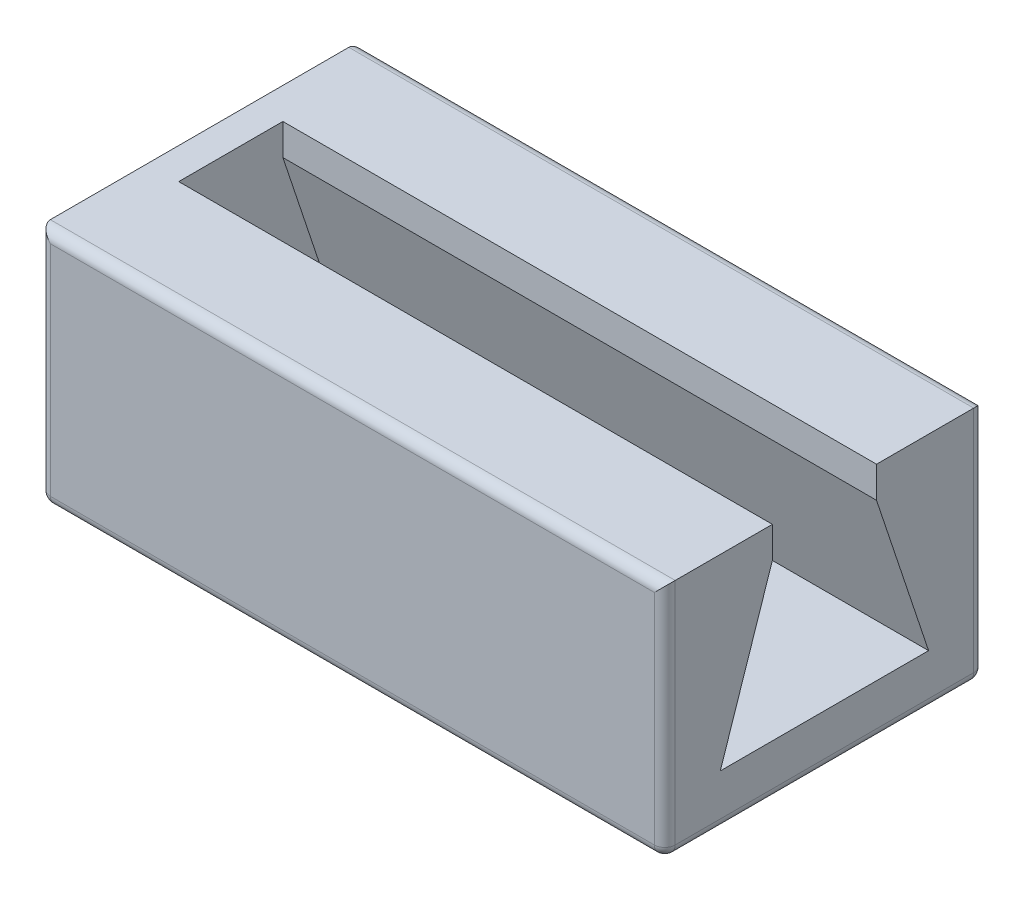
ISO-10303-21;
HEADER;
FILE_DESCRIPTION(('STEP AP214'),'2;1');
FILE_NAME('part.step','',(''),(''),'','','');
FILE_SCHEMA(('AUTOMOTIVE_DESIGN { 1 0 10303 214 1 1 1 1 }'));
ENDSEC;
DATA;
#1=APPLICATION_CONTEXT('core data for automotive mechanical design processes');
#2=APPLICATION_PROTOCOL_DEFINITION('international standard','automotive_design',2000,#1);
#3=PRODUCT_CONTEXT('',#1,'mechanical');
#4=PRODUCT('Part','Part','',(#3));
#5=PRODUCT_RELATED_PRODUCT_CATEGORY('part','',(#4));
#6=PRODUCT_DEFINITION_FORMATION('','',#4);
#7=PRODUCT_DEFINITION_CONTEXT('part definition',#1,'design');
#8=PRODUCT_DEFINITION('design','',#6,#7);
#9=PRODUCT_DEFINITION_SHAPE('','',#8);
#10=(LENGTH_UNIT() NAMED_UNIT(*) SI_UNIT(.MILLI.,.METRE.));
#11=(NAMED_UNIT(*) PLANE_ANGLE_UNIT() SI_UNIT($,.RADIAN.));
#12=(NAMED_UNIT(*) SI_UNIT($,.STERADIAN.) SOLID_ANGLE_UNIT());
#13=UNCERTAINTY_MEASURE_WITH_UNIT(LENGTH_MEASURE(1.E-05),#10,'distance_accuracy_value','');
#14=(GEOMETRIC_REPRESENTATION_CONTEXT(3) GLOBAL_UNCERTAINTY_ASSIGNED_CONTEXT((#13)) GLOBAL_UNIT_ASSIGNED_CONTEXT((#10,
#11,#12)) REPRESENTATION_CONTEXT('',''));
#15=CARTESIAN_POINT('',(0.,0.,0.));
#16=DIRECTION('',(0.,0.,1.));
#17=DIRECTION('',(1.,0.,0.));
#18=AXIS2_PLACEMENT_3D('',#15,#16,#17);
#19=CARTESIAN_POINT('',(60.,0.,-30.66));
#20=DIRECTION('',(0.,1.,0.));
#21=DIRECTION('',(0.,0.,1.));
#22=AXIS2_PLACEMENT_3D('',#19,#20,#21);
#23=PLANE('',#22);
#24=DIRECTION('',(-1.,0.,0.));
#25=VECTOR('',#24,1.);
#26=CARTESIAN_POINT('',(60.,0.,-1.));
#27=LINE('',#26,#25);
#28=CARTESIAN_POINT('',(59.,0.,-1.));
#29=VERTEX_POINT('',#28);
#30=CARTESIAN_POINT('',(1.,0.,-1.));
#31=VERTEX_POINT('',#30);
#32=EDGE_CURVE('E208',#29,#31,#27,.T.);
#33=ORIENTED_EDGE('',*,*,#32,.T.);
#34=DIRECTION('',(0.,0.,-1.));
#35=VECTOR('',#34,1.);
#36=CARTESIAN_POINT('',(1.,0.,-30.66));
#37=LINE('',#36,#35);
#38=CARTESIAN_POINT('',(1.,0.,-29.66));
#39=VERTEX_POINT('',#38);
#40=EDGE_CURVE('E213',#31,#39,#37,.T.);
#41=ORIENTED_EDGE('',*,*,#40,.T.);
#42=DIRECTION('',(-1.,0.,0.));
#43=VECTOR('',#42,1.);
#44=CARTESIAN_POINT('',(60.,0.,-29.66));
#45=LINE('',#44,#43);
#46=CARTESIAN_POINT('',(59.,0.,-29.66));
#47=VERTEX_POINT('',#46);
#48=EDGE_CURVE('E210',#39,#47,#45,.F.);
#49=ORIENTED_EDGE('',*,*,#48,.T.);
#50=DIRECTION('',(0.,0.,-1.));
#51=VECTOR('',#50,1.);
#52=CARTESIAN_POINT('',(59.,0.,-30.66));
#53=LINE('',#52,#51);
#54=EDGE_CURVE('E206',#47,#29,#53,.F.);
#55=ORIENTED_EDGE('',*,*,#54,.T.);
#56=EDGE_LOOP('',(#33,#41,#49,#55));
#57=FACE_BOUND('',#56,.T.);
#58=ADVANCED_FACE('F37',(#57),#23,.F.);
#59=CARTESIAN_POINT('',(60.,23.,-30.66));
#60=DIRECTION('',(0.,0.,1.));
#61=DIRECTION('',(0.,-1.,0.));
#62=AXIS2_PLACEMENT_3D('',#59,#60,#61);
#63=PLANE('',#62);
#64=DIRECTION('',(0.,1.,0.));
#65=VECTOR('',#64,1.);
#66=CARTESIAN_POINT('',(59.,23.,-30.66));
#67=LINE('',#66,#65);
#68=CARTESIAN_POINT('',(59.,22.,-30.66));
#69=VERTEX_POINT('',#68);
#70=CARTESIAN_POINT('',(59.,0.999999999999998,-30.66));
#71=VERTEX_POINT('',#70);
#72=EDGE_CURVE('E201',#69,#71,#67,.F.);
#73=ORIENTED_EDGE('',*,*,#72,.T.);
#74=DIRECTION('',(-1.,0.,0.));
#75=VECTOR('',#74,1.);
#76=CARTESIAN_POINT('',(60.,0.999999999999997,-30.66));
#77=LINE('',#76,#75);
#78=CARTESIAN_POINT('',(1.,0.999999999999998,-30.66));
#79=VERTEX_POINT('',#78);
#80=EDGE_CURVE('E203',#71,#79,#77,.T.);
#81=ORIENTED_EDGE('',*,*,#80,.T.);
#82=DIRECTION('',(0.,1.,0.));
#83=VECTOR('',#82,1.);
#84=CARTESIAN_POINT('',(1.,23.,-30.66));
#85=LINE('',#84,#83);
#86=CARTESIAN_POINT('',(1.,22.,-30.66));
#87=VERTEX_POINT('',#86);
#88=EDGE_CURVE('E166',#79,#87,#85,.T.);
#89=ORIENTED_EDGE('',*,*,#88,.T.);
#90=DIRECTION('',(-1.,0.,0.));
#91=VECTOR('',#90,1.);
#92=CARTESIAN_POINT('',(60.,22.,-30.66));
#93=LINE('',#92,#91);
#94=EDGE_CURVE('E199',#87,#69,#93,.F.);
#95=ORIENTED_EDGE('',*,*,#94,.T.);
#96=EDGE_LOOP('',(#73,#81,#89,#95));
#97=FACE_BOUND('',#96,.T.);
#98=ADVANCED_FACE('F353',(#97),#63,.F.);
#99=CARTESIAN_POINT('',(60.,20.,-20.33));
#100=DIRECTION('',(0.,0.,-1.));
#101=DIRECTION('',(0.,1.,0.));
#102=AXIS2_PLACEMENT_3D('',#99,#100,#101);
#103=PLANE('',#102);
#104=DIRECTION('',(-1.,0.,0.));
#105=VECTOR('',#104,1.);
#106=CARTESIAN_POINT('',(60.,23.,-20.33));
#107=LINE('',#106,#105);
#108=CARTESIAN_POINT('',(60.,23.,-20.33));
#109=VERTEX_POINT('',#108);
#110=CARTESIAN_POINT('',(3.,23.,-20.33));
#111=VERTEX_POINT('',#110);
#112=EDGE_CURVE('E54',#109,#111,#107,.T.);
#113=ORIENTED_EDGE('',*,*,#112,.T.);
#114=DIRECTION('',(0.,-1.,0.));
#115=VECTOR('',#114,1.);
#116=CARTESIAN_POINT('',(3.,20.,-20.33));
#117=LINE('',#116,#115);
#118=CARTESIAN_POINT('',(3.,20.,-20.33));
#119=VERTEX_POINT('',#118);
#120=EDGE_CURVE('E58',#111,#119,#117,.T.);
#121=ORIENTED_EDGE('',*,*,#120,.T.);
#122=DIRECTION('',(-1.,0.,0.));
#123=VECTOR('',#122,1.);
#124=CARTESIAN_POINT('',(60.,20.,-20.33));
#125=LINE('',#124,#123);
#126=CARTESIAN_POINT('',(60.,20.,-20.33));
#127=VERTEX_POINT('',#126);
#128=EDGE_CURVE('E167',#127,#119,#125,.T.);
#129=ORIENTED_EDGE('',*,*,#128,.F.);
#130=DIRECTION('',(0.,-1.,0.));
#131=VECTOR('',#130,1.);
#132=CARTESIAN_POINT('',(60.,20.,-20.33));
#133=LINE('',#132,#131);
#134=EDGE_CURVE('E153',#109,#127,#133,.T.);
#135=ORIENTED_EDGE('',*,*,#134,.F.);
#136=EDGE_LOOP('',(#113,#121,#129,#135));
#137=FACE_BOUND('',#136,.T.);
#138=ADVANCED_FACE('F169',(#137),#103,.F.);
#139=CARTESIAN_POINT('',(60.,4.99568021794421,-25.33));
#140=DIRECTION('',(0.,0.31614582397381,-0.948710608132913));
#141=DIRECTION('',(0.,0.948710608132913,0.31614582397381));
#142=AXIS2_PLACEMENT_3D('',#139,#140,#141);
#143=PLANE('',#142);
#144=ORIENTED_EDGE('',*,*,#128,.T.);
#145=DIRECTION('',(0.,-0.948710608132913,-0.31614582397381));
#146=VECTOR('',#145,1.);
#147=CARTESIAN_POINT('',(3.,4.99568021794421,-25.33));
#148=LINE('',#147,#146);
#149=CARTESIAN_POINT('',(3.,4.99568021794421,-25.33));
#150=VERTEX_POINT('',#149);
#151=EDGE_CURVE('E625',#119,#150,#148,.T.);
#152=ORIENTED_EDGE('',*,*,#151,.T.);
#153=DIRECTION('',(-1.,0.,0.));
#154=VECTOR('',#153,1.);
#155=CARTESIAN_POINT('',(60.,4.99568021794421,-25.33));
#156=LINE('',#155,#154);
#157=CARTESIAN_POINT('',(60.,4.99568021794421,-25.33));
#158=VERTEX_POINT('',#157);
#159=EDGE_CURVE('E194',#158,#150,#156,.T.);
#160=ORIENTED_EDGE('',*,*,#159,.F.);
#161=DIRECTION('',(0.,-0.948710608132913,-0.31614582397381));
#162=VECTOR('',#161,1.);
#163=CARTESIAN_POINT('',(60.,4.99568021794421,-25.33));
#164=LINE('',#163,#162);
#165=EDGE_CURVE('E171',#127,#158,#164,.T.);
#166=ORIENTED_EDGE('',*,*,#165,.F.);
#167=EDGE_LOOP('',(#144,#152,#160,#166));
#168=FACE_BOUND('',#167,.T.);
#169=ADVANCED_FACE('F391',(#168),#143,.F.);
#170=CARTESIAN_POINT('',(60.,4.99568021794422,-5.33));
#171=DIRECTION('',(0.,-1.,0.));
#172=DIRECTION('',(0.,0.,-1.));
#173=AXIS2_PLACEMENT_3D('',#170,#171,#172);
#174=PLANE('',#173);
#175=ORIENTED_EDGE('',*,*,#159,.T.);
#176=DIRECTION('',(0.,0.,1.));
#177=VECTOR('',#176,1.);
#178=CARTESIAN_POINT('',(3.,4.99568021794422,-5.33));
#179=LINE('',#178,#177);
#180=CARTESIAN_POINT('',(3.,4.99568021794422,-5.33));
#181=VERTEX_POINT('',#180);
#182=EDGE_CURVE('E628',#150,#181,#179,.T.);
#183=ORIENTED_EDGE('',*,*,#182,.T.);
#184=DIRECTION('',(-1.,0.,0.));
#185=VECTOR('',#184,1.);
#186=CARTESIAN_POINT('',(60.,4.99568021794422,-5.33));
#187=LINE('',#186,#185);
#188=CARTESIAN_POINT('',(60.,4.99568021794422,-5.33));
#189=VERTEX_POINT('',#188);
#190=EDGE_CURVE('E191',#189,#181,#187,.T.);
#191=ORIENTED_EDGE('',*,*,#190,.F.);
#192=DIRECTION('',(0.,0.,1.));
#193=VECTOR('',#192,1.);
#194=CARTESIAN_POINT('',(60.,4.99568021794422,-5.33));
#195=LINE('',#194,#193);
#196=EDGE_CURVE('E173',#158,#189,#195,.T.);
#197=ORIENTED_EDGE('',*,*,#196,.F.);
#198=EDGE_LOOP('',(#175,#183,#191,#197));
#199=FACE_BOUND('',#198,.T.);
#200=ADVANCED_FACE('F387',(#199),#174,.F.);
#201=CARTESIAN_POINT('',(60.,20.,-10.33));
#202=DIRECTION('',(0.,0.31614582397381,0.948710608132913));
#203=DIRECTION('',(0.,-0.948710608132913,0.31614582397381));
#204=AXIS2_PLACEMENT_3D('',#201,#202,#203);
#205=PLANE('',#204);
#206=ORIENTED_EDGE('',*,*,#190,.T.);
#207=DIRECTION('',(0.,0.948710608132913,-0.31614582397381));
#208=VECTOR('',#207,1.);
#209=CARTESIAN_POINT('',(3.,20.,-10.33));
#210=LINE('',#209,#208);
#211=CARTESIAN_POINT('',(3.,20.,-10.33));
#212=VERTEX_POINT('',#211);
#213=EDGE_CURVE('E630',#181,#212,#210,.T.);
#214=ORIENTED_EDGE('',*,*,#213,.T.);
#215=DIRECTION('',(-1.,0.,0.));
#216=VECTOR('',#215,1.);
#217=CARTESIAN_POINT('',(60.,20.,-10.33));
#218=LINE('',#217,#216);
#219=CARTESIAN_POINT('',(60.,20.,-10.33));
#220=VERTEX_POINT('',#219);
#221=EDGE_CURVE('E188',#220,#212,#218,.T.);
#222=ORIENTED_EDGE('',*,*,#221,.F.);
#223=DIRECTION('',(0.,0.948710608132913,-0.31614582397381));
#224=VECTOR('',#223,1.);
#225=CARTESIAN_POINT('',(60.,20.,-10.33));
#226=LINE('',#225,#224);
#227=EDGE_CURVE('E178',#189,#220,#226,.T.);
#228=ORIENTED_EDGE('',*,*,#227,.F.);
#229=EDGE_LOOP('',(#206,#214,#222,#228));
#230=FACE_BOUND('',#229,.T.);
#231=ADVANCED_FACE('F383',(#230),#205,.F.);
#232=CARTESIAN_POINT('',(60.,23.,-10.33));
#233=DIRECTION('',(0.,0.,1.));
#234=DIRECTION('',(1.,0.,0.));
#235=AXIS2_PLACEMENT_3D('',#232,#233,#234);
#236=PLANE('',#235);
#237=ORIENTED_EDGE('',*,*,#221,.T.);
#238=DIRECTION('',(0.,1.,0.));
#239=VECTOR('',#238,1.);
#240=CARTESIAN_POINT('',(3.,23.,-10.33));
#241=LINE('',#240,#239);
#242=CARTESIAN_POINT('',(3.,23.,-10.33));
#243=VERTEX_POINT('',#242);
#244=EDGE_CURVE('E635',#212,#243,#241,.T.);
#245=ORIENTED_EDGE('',*,*,#244,.T.);
#246=DIRECTION('',(-1.,0.,0.));
#247=VECTOR('',#246,1.);
#248=CARTESIAN_POINT('',(60.,23.,-10.33));
#249=LINE('',#248,#247);
#250=CARTESIAN_POINT('',(60.,23.,-10.33));
#251=VERTEX_POINT('',#250);
#252=EDGE_CURVE('E185',#251,#243,#249,.T.);
#253=ORIENTED_EDGE('',*,*,#252,.F.);
#254=DIRECTION('',(0.,1.,0.));
#255=VECTOR('',#254,1.);
#256=CARTESIAN_POINT('',(60.,23.,-10.33));
#257=LINE('',#256,#255);
#258=EDGE_CURVE('E180',#220,#251,#257,.T.);
#259=ORIENTED_EDGE('',*,*,#258,.F.);
#260=EDGE_LOOP('',(#237,#245,#253,#259));
#261=FACE_BOUND('',#260,.T.);
#262=ADVANCED_FACE('F380',(#261),#236,.F.);
#263=CARTESIAN_POINT('',(60.,23.,0.));
#264=DIRECTION('',(0.,-1.,0.));
#265=DIRECTION('',(0.,0.,-1.));
#266=AXIS2_PLACEMENT_3D('',#263,#264,#265);
#267=PLANE('',#266);
#268=DIRECTION('',(0.,0.,1.));
#269=VECTOR('',#268,1.);
#270=CARTESIAN_POINT('',(0.,23.,0.));
#271=LINE('',#270,#269);
#272=CARTESIAN_POINT('',(0.,23.,-29.66));
#273=VERTEX_POINT('',#272);
#274=CARTESIAN_POINT('',(0.,23.,-1.));
#275=VERTEX_POINT('',#274);
#276=EDGE_CURVE('E158',#273,#275,#271,.T.);
#277=ORIENTED_EDGE('',*,*,#276,.T.);
#278=DIRECTION('',(-1.,0.,0.));
#279=VECTOR('',#278,1.);
#280=CARTESIAN_POINT('',(60.,23.,-1.));
#281=LINE('',#280,#279);
#282=CARTESIAN_POINT('',(60.,23.,-1.));
#283=VERTEX_POINT('',#282);
#284=EDGE_CURVE('E11',#275,#283,#281,.F.);
#285=ORIENTED_EDGE('',*,*,#284,.T.);
#286=DIRECTION('',(0.,0.,1.));
#287=VECTOR('',#286,1.);
#288=CARTESIAN_POINT('',(60.,23.,0.));
#289=LINE('',#288,#287);
#290=EDGE_CURVE('E182',#251,#283,#289,.T.);
#291=ORIENTED_EDGE('',*,*,#290,.F.);
#292=ORIENTED_EDGE('',*,*,#252,.T.);
#293=DIRECTION('',(0.,0.,-1.));
#294=VECTOR('',#293,1.);
#295=CARTESIAN_POINT('',(3.,23.,-20.33));
#296=LINE('',#295,#294);
#297=EDGE_CURVE('E165',#243,#111,#296,.T.);
#298=ORIENTED_EDGE('',*,*,#297,.T.);
#299=ORIENTED_EDGE('',*,*,#112,.F.);
#300=DIRECTION('',(0.,0.,1.));
#301=VECTOR('',#300,1.);
#302=CARTESIAN_POINT('',(60.,23.,-20.33));
#303=LINE('',#302,#301);
#304=CARTESIAN_POINT('',(60.,23.,-29.66));
#305=VERTEX_POINT('',#304);
#306=EDGE_CURVE('E151',#305,#109,#303,.T.);
#307=ORIENTED_EDGE('',*,*,#306,.F.);
#308=DIRECTION('',(-1.,0.,0.));
#309=VECTOR('',#308,1.);
#310=CARTESIAN_POINT('',(60.,23.,-29.66));
#311=LINE('',#310,#309);
#312=EDGE_CURVE('E220',#305,#273,#311,.T.);
#313=ORIENTED_EDGE('',*,*,#312,.T.);
#314=EDGE_LOOP('',(#277,#285,#291,#292,#298,#299,#307,#313));
#315=FACE_BOUND('',#314,.T.);
#316=ADVANCED_FACE('F162',(#315),#267,.F.);
#317=CARTESIAN_POINT('',(60.,0.,0.));
#318=DIRECTION('',(0.,0.,-1.));
#319=DIRECTION('',(-1.,0.,0.));
#320=AXIS2_PLACEMENT_3D('',#317,#318,#319);
#321=PLANE('',#320);
#322=DIRECTION('',(0.,-1.,0.));
#323=VECTOR('',#322,1.);
#324=CARTESIAN_POINT('',(59.,0.,0.));
#325=LINE('',#324,#323);
#326=CARTESIAN_POINT('',(59.,1.,0.));
#327=VERTEX_POINT('',#326);
#328=CARTESIAN_POINT('',(59.,22.,0.));
#329=VERTEX_POINT('',#328);
#330=EDGE_CURVE('E232',#327,#329,#325,.F.);
#331=ORIENTED_EDGE('',*,*,#330,.T.);
#332=DIRECTION('',(-1.,0.,0.));
#333=VECTOR('',#332,1.);
#334=CARTESIAN_POINT('',(60.,22.,0.));
#335=LINE('',#334,#333);
#336=CARTESIAN_POINT('',(1.,22.,0.));
#337=VERTEX_POINT('',#336);
#338=EDGE_CURVE('E46',#329,#337,#335,.T.);
#339=ORIENTED_EDGE('',*,*,#338,.T.);
#340=DIRECTION('',(0.,-1.,0.));
#341=VECTOR('',#340,1.);
#342=CARTESIAN_POINT('',(1.,0.,0.));
#343=LINE('',#342,#341);
#344=CARTESIAN_POINT('',(1.,1.,0.));
#345=VERTEX_POINT('',#344);
#346=EDGE_CURVE('E228',#337,#345,#343,.T.);
#347=ORIENTED_EDGE('',*,*,#346,.T.);
#348=DIRECTION('',(-1.,0.,0.));
#349=VECTOR('',#348,1.);
#350=CARTESIAN_POINT('',(60.,1.,0.));
#351=LINE('',#350,#349);
#352=EDGE_CURVE('E230',#345,#327,#351,.F.);
#353=ORIENTED_EDGE('',*,*,#352,.T.);
#354=EDGE_LOOP('',(#331,#339,#347,#353));
#355=FACE_BOUND('',#354,.T.);
#356=ADVANCED_FACE('F291',(#355),#321,.F.);
#357=CARTESIAN_POINT('',(60.,0.,0.));
#358=DIRECTION('',(-1.,0.,0.));
#359=DIRECTION('',(0.,0.,1.));
#360=AXIS2_PLACEMENT_3D('',#357,#358,#359);
#361=PLANE('',#360);
#362=DIRECTION('',(0.,0.,-1.));
#363=VECTOR('',#362,1.);
#364=CARTESIAN_POINT('',(60.,1.,0.));
#365=LINE('',#364,#363);
#366=CARTESIAN_POINT('',(60.,1.,-1.));
#367=VERTEX_POINT('',#366);
#368=CARTESIAN_POINT('',(60.,0.999999999999998,-29.66));
#369=VERTEX_POINT('',#368);
#370=EDGE_CURVE('E215',#367,#369,#365,.T.);
#371=ORIENTED_EDGE('',*,*,#370,.T.);
#372=DIRECTION('',(0.,1.,0.));
#373=VECTOR('',#372,1.);
#374=CARTESIAN_POINT('',(60.,0.,-29.66));
#375=LINE('',#374,#373);
#376=EDGE_CURVE('E155',#369,#305,#375,.T.);
#377=ORIENTED_EDGE('',*,*,#376,.T.);
#378=ORIENTED_EDGE('',*,*,#306,.T.);
#379=ORIENTED_EDGE('',*,*,#134,.T.);
#380=ORIENTED_EDGE('',*,*,#165,.T.);
#381=ORIENTED_EDGE('',*,*,#196,.T.);
#382=ORIENTED_EDGE('',*,*,#227,.T.);
#383=ORIENTED_EDGE('',*,*,#258,.T.);
#384=ORIENTED_EDGE('',*,*,#290,.T.);
#385=DIRECTION('',(0.,-1.,0.));
#386=VECTOR('',#385,1.);
#387=CARTESIAN_POINT('',(60.,0.,-1.));
#388=LINE('',#387,#386);
#389=EDGE_CURVE('E217',#283,#367,#388,.T.);
#390=ORIENTED_EDGE('',*,*,#389,.T.);
#391=EDGE_LOOP('',(#371,#377,#378,#379,#380,#381,#382,#383,#384,#390));
#392=FACE_BOUND('',#391,.T.);
#393=ADVANCED_FACE('F152',(#392),#361,.F.);
#394=CARTESIAN_POINT('',(0.,0.,0.));
#395=DIRECTION('',(-1.,0.,0.));
#396=DIRECTION('',(0.,0.,1.));
#397=AXIS2_PLACEMENT_3D('',#394,#395,#396);
#398=PLANE('',#397);
#399=ORIENTED_EDGE('',*,*,#276,.F.);
#400=DIRECTION('',(0.,1.,0.));
#401=VECTOR('',#400,1.);
#402=CARTESIAN_POINT('',(0.,0.,-29.66));
#403=LINE('',#402,#401);
#404=CARTESIAN_POINT('',(0.,0.999999999999998,-29.66));
#405=VERTEX_POINT('',#404);
#406=EDGE_CURVE('E226',#273,#405,#403,.F.);
#407=ORIENTED_EDGE('',*,*,#406,.T.);
#408=DIRECTION('',(0.,0.,-1.));
#409=VECTOR('',#408,1.);
#410=CARTESIAN_POINT('',(0.,1.,0.));
#411=LINE('',#410,#409);
#412=CARTESIAN_POINT('',(0.,1.,-1.));
#413=VERTEX_POINT('',#412);
#414=EDGE_CURVE('E222',#405,#413,#411,.F.);
#415=ORIENTED_EDGE('',*,*,#414,.T.);
#416=DIRECTION('',(0.,-1.,0.));
#417=VECTOR('',#416,1.);
#418=CARTESIAN_POINT('',(0.,23.,-1.));
#419=LINE('',#418,#417);
#420=EDGE_CURVE('E224',#413,#275,#419,.F.);
#421=ORIENTED_EDGE('',*,*,#420,.T.);
#422=EDGE_LOOP('',(#399,#407,#415,#421));
#423=FACE_BOUND('',#422,.T.);
#424=ADVANCED_FACE('F331',(#423),#398,.T.);
#425=CARTESIAN_POINT('',(60.,22.,-1.));
#426=DIRECTION('',(-1.,0.,0.));
#427=DIRECTION('',(0.,0.,1.));
#428=AXIS2_PLACEMENT_3D('',#425,#426,#427);
#429=CYLINDRICAL_SURFACE('',#428,1.);
#430=CARTESIAN_POINT('',(1.,22.,-1.));
#431=DIRECTION('',(0.707106781186547,0.707106781186547,0.));
#432=DIRECTION('',(-0.707106781186547,0.707106781186547,0.));
#433=AXIS2_PLACEMENT_3D('',#430,#431,#432);
#434=ELLIPSE('',#433,1.41421356237309,1.);
#435=EDGE_CURVE('E274',#337,#275,#434,.F.);
#436=ORIENTED_EDGE('',*,*,#435,.F.);
#437=ORIENTED_EDGE('',*,*,#338,.F.);
#438=CARTESIAN_POINT('',(59.,22.,-1.));
#439=DIRECTION('',(0.707106781186547,-0.707106781186547,0.));
#440=DIRECTION('',(-0.707106781186547,-0.707106781186547,0.));
#441=AXIS2_PLACEMENT_3D('',#438,#439,#440);
#442=ELLIPSE('',#441,1.41421356237309,1.);
#443=EDGE_CURVE('E41',#283,#329,#442,.T.);
#444=ORIENTED_EDGE('',*,*,#443,.F.);
#445=ORIENTED_EDGE('',*,*,#284,.F.);
#446=EDGE_LOOP('',(#436,#437,#444,#445));
#447=FACE_BOUND('',#446,.T.);
#448=ADVANCED_FACE('F39',(#447),#429,.T.);
#449=CARTESIAN_POINT('',(59.,0.,-1.));
#450=DIRECTION('',(0.,-1.,0.));
#451=DIRECTION('',(0.,0.,-1.));
#452=AXIS2_PLACEMENT_3D('',#449,#450,#451);
#453=CYLINDRICAL_SURFACE('',#452,1.);
#454=ORIENTED_EDGE('',*,*,#443,.T.);
#455=ORIENTED_EDGE('',*,*,#330,.F.);
#456=CARTESIAN_POINT('',(59.,1.,-1.));
#457=DIRECTION('',(0.,-1.,0.));
#458=DIRECTION('',(0.,0.,-1.));
#459=AXIS2_PLACEMENT_3D('',#456,#457,#458);
#460=CIRCLE('',#459,1.);
#461=EDGE_CURVE('E269',#367,#327,#460,.T.);
#462=ORIENTED_EDGE('',*,*,#461,.F.);
#463=ORIENTED_EDGE('',*,*,#389,.F.);
#464=EDGE_LOOP('',(#454,#455,#462,#463));
#465=FACE_BOUND('',#464,.T.);
#466=ADVANCED_FACE('F284',(#465),#453,.T.);
#467=CARTESIAN_POINT('',(1.,0.,-1.));
#468=DIRECTION('',(0.,1.,0.));
#469=DIRECTION('',(0.,0.,1.));
#470=AXIS2_PLACEMENT_3D('',#467,#468,#469);
#471=CYLINDRICAL_SURFACE('',#470,1.);
#472=ORIENTED_EDGE('',*,*,#435,.T.);
#473=ORIENTED_EDGE('',*,*,#420,.F.);
#474=CARTESIAN_POINT('',(1.,1.,-1.));
#475=DIRECTION('',(0.,-1.,0.));
#476=DIRECTION('',(0.,0.,-1.));
#477=AXIS2_PLACEMENT_3D('',#474,#475,#476);
#478=CIRCLE('',#477,1.);
#479=EDGE_CURVE('E266',#345,#413,#478,.T.);
#480=ORIENTED_EDGE('',*,*,#479,.F.);
#481=ORIENTED_EDGE('',*,*,#346,.F.);
#482=EDGE_LOOP('',(#472,#473,#480,#481));
#483=FACE_BOUND('',#482,.T.);
#484=ADVANCED_FACE('F299',(#483),#471,.T.);
#485=CARTESIAN_POINT('',(60.,1.,-1.));
#486=DIRECTION('',(-1.,0.,0.));
#487=DIRECTION('',(0.,0.,1.));
#488=AXIS2_PLACEMENT_3D('',#485,#486,#487);
#489=CYLINDRICAL_SURFACE('',#488,1.);
#490=CARTESIAN_POINT('',(59.,1.,-1.));
#491=DIRECTION('',(1.,0.,0.));
#492=DIRECTION('',(0.,0.,-1.));
#493=AXIS2_PLACEMENT_3D('',#490,#491,#492);
#494=CIRCLE('',#493,1.);
#495=EDGE_CURVE('E272',#327,#29,#494,.T.);
#496=ORIENTED_EDGE('',*,*,#495,.F.);
#497=ORIENTED_EDGE('',*,*,#352,.F.);
#498=CARTESIAN_POINT('',(1.,1.,-1.));
#499=DIRECTION('',(-1.,0.,0.));
#500=DIRECTION('',(0.,0.,1.));
#501=AXIS2_PLACEMENT_3D('',#498,#499,#500);
#502=CIRCLE('',#501,1.);
#503=EDGE_CURVE('E263',#31,#345,#502,.T.);
#504=ORIENTED_EDGE('',*,*,#503,.F.);
#505=ORIENTED_EDGE('',*,*,#32,.F.);
#506=EDGE_LOOP('',(#496,#497,#504,#505));
#507=FACE_BOUND('',#506,.T.);
#508=ADVANCED_FACE('F296',(#507),#489,.T.);
#509=CARTESIAN_POINT('',(59.,1.,-1.));
#510=DIRECTION('',(0.,0.,1.));
#511=DIRECTION('',(1.,0.,0.));
#512=AXIS2_PLACEMENT_3D('',#509,#510,#511);
#513=SPHERICAL_SURFACE('',#512,1.);
#514=ORIENTED_EDGE('',*,*,#461,.T.);
#515=ORIENTED_EDGE('',*,*,#495,.T.);
#516=CARTESIAN_POINT('',(59.,1.,-1.));
#517=DIRECTION('',(0.,0.,1.));
#518=DIRECTION('',(1.,0.,0.));
#519=AXIS2_PLACEMENT_3D('',#516,#517,#518);
#520=CIRCLE('',#519,1.);
#521=EDGE_CURVE('E260',#367,#29,#520,.F.);
#522=ORIENTED_EDGE('',*,*,#521,.F.);
#523=EDGE_LOOP('',(#514,#515,#522));
#524=FACE_BOUND('',#523,.T.);
#525=ADVANCED_FACE('F312',(#524),#513,.T.);
#526=CARTESIAN_POINT('',(60.,22.,-29.66));
#527=DIRECTION('',(-1.,0.,0.));
#528=DIRECTION('',(0.,0.,1.));
#529=AXIS2_PLACEMENT_3D('',#526,#527,#528);
#530=CYLINDRICAL_SURFACE('',#529,1.);
#531=CARTESIAN_POINT('',(1.,22.,-29.66));
#532=DIRECTION('',(-0.707106781186547,-0.707106781186547,0.));
#533=DIRECTION('',(0.707106781186547,-0.707106781186547,0.));
#534=AXIS2_PLACEMENT_3D('',#531,#532,#533);
#535=ELLIPSE('',#534,1.41421356237309,1.);
#536=EDGE_CURVE('E255',#273,#87,#535,.T.);
#537=ORIENTED_EDGE('',*,*,#536,.F.);
#538=ORIENTED_EDGE('',*,*,#312,.F.);
#539=CARTESIAN_POINT('',(59.,22.,-29.66));
#540=DIRECTION('',(-0.707106781186547,0.707106781186547,0.));
#541=DIRECTION('',(-0.707106781186547,-0.707106781186547,0.));
#542=AXIS2_PLACEMENT_3D('',#539,#540,#541);
#543=ELLIPSE('',#542,1.41421356237309,1.);
#544=EDGE_CURVE('E258',#69,#305,#543,.F.);
#545=ORIENTED_EDGE('',*,*,#544,.F.);
#546=ORIENTED_EDGE('',*,*,#94,.F.);
#547=EDGE_LOOP('',(#537,#538,#545,#546));
#548=FACE_BOUND('',#547,.T.);
#549=ADVANCED_FACE('F327',(#548),#530,.T.);
#550=CARTESIAN_POINT('',(1.,1.,-1.));
#551=DIRECTION('',(0.,0.,1.));
#552=DIRECTION('',(1.,0.,0.));
#553=AXIS2_PLACEMENT_3D('',#550,#551,#552);
#554=SPHERICAL_SURFACE('',#553,1.);
#555=ORIENTED_EDGE('',*,*,#503,.T.);
#556=ORIENTED_EDGE('',*,*,#479,.T.);
#557=CARTESIAN_POINT('',(1.,1.,-1.));
#558=DIRECTION('',(0.,0.,1.));
#559=DIRECTION('',(0.,-1.,0.));
#560=AXIS2_PLACEMENT_3D('',#557,#558,#559);
#561=CIRCLE('',#560,1.);
#562=EDGE_CURVE('E252',#31,#413,#561,.F.);
#563=ORIENTED_EDGE('',*,*,#562,.F.);
#564=EDGE_LOOP('',(#555,#556,#563));
#565=FACE_BOUND('',#564,.T.);
#566=ADVANCED_FACE('F301',(#565),#554,.T.);
#567=CARTESIAN_POINT('',(59.,1.,0.));
#568=DIRECTION('',(0.,0.,-1.));
#569=DIRECTION('',(0.,1.,0.));
#570=AXIS2_PLACEMENT_3D('',#567,#568,#569);
#571=CYLINDRICAL_SURFACE('',#570,1.);
#572=ORIENTED_EDGE('',*,*,#521,.T.);
#573=ORIENTED_EDGE('',*,*,#54,.F.);
#574=CARTESIAN_POINT('',(59.,0.999999999999998,-29.66));
#575=DIRECTION('',(0.,0.,-1.));
#576=DIRECTION('',(-1.,0.,0.));
#577=AXIS2_PLACEMENT_3D('',#574,#575,#576);
#578=CIRCLE('',#577,1.);
#579=EDGE_CURVE('E249',#369,#47,#578,.T.);
#580=ORIENTED_EDGE('',*,*,#579,.F.);
#581=ORIENTED_EDGE('',*,*,#370,.F.);
#582=EDGE_LOOP('',(#572,#573,#580,#581));
#583=FACE_BOUND('',#582,.T.);
#584=ADVANCED_FACE('F315',(#583),#571,.T.);
#585=CARTESIAN_POINT('',(59.,0.,-29.66));
#586=DIRECTION('',(0.,1.,0.));
#587=DIRECTION('',(0.,0.,1.));
#588=AXIS2_PLACEMENT_3D('',#585,#586,#587);
#589=CYLINDRICAL_SURFACE('',#588,1.);
#590=ORIENTED_EDGE('',*,*,#544,.T.);
#591=ORIENTED_EDGE('',*,*,#376,.F.);
#592=CARTESIAN_POINT('',(59.,0.999999999999997,-29.66));
#593=DIRECTION('',(0.,-1.,0.));
#594=DIRECTION('',(0.,0.,-1.));
#595=AXIS2_PLACEMENT_3D('',#592,#593,#594);
#596=CIRCLE('',#595,1.);
#597=EDGE_CURVE('E246',#71,#369,#596,.T.);
#598=ORIENTED_EDGE('',*,*,#597,.F.);
#599=ORIENTED_EDGE('',*,*,#72,.F.);
#600=EDGE_LOOP('',(#590,#591,#598,#599));
#601=FACE_BOUND('',#600,.T.);
#602=ADVANCED_FACE('F319',(#601),#589,.T.);
#603=CARTESIAN_POINT('',(1.,23.,-29.66));
#604=DIRECTION('',(0.,-1.,0.));
#605=DIRECTION('',(0.,0.,-1.));
#606=AXIS2_PLACEMENT_3D('',#603,#604,#605);
#607=CYLINDRICAL_SURFACE('',#606,1.);
#608=ORIENTED_EDGE('',*,*,#536,.T.);
#609=ORIENTED_EDGE('',*,*,#88,.F.);
#610=CARTESIAN_POINT('',(1.,0.999999999999998,-29.66));
#611=DIRECTION('',(0.,-1.,0.));
#612=DIRECTION('',(0.,0.,-1.));
#613=AXIS2_PLACEMENT_3D('',#610,#611,#612);
#614=CIRCLE('',#613,1.);
#615=EDGE_CURVE('E243',#405,#79,#614,.T.);
#616=ORIENTED_EDGE('',*,*,#615,.F.);
#617=ORIENTED_EDGE('',*,*,#406,.F.);
#618=EDGE_LOOP('',(#608,#609,#616,#617));
#619=FACE_BOUND('',#618,.T.);
#620=ADVANCED_FACE('F335',(#619),#607,.T.);
#621=CARTESIAN_POINT('',(1.,0.999999999999998,-30.66));
#622=DIRECTION('',(0.,0.,1.));
#623=DIRECTION('',(0.,-1.,0.));
#624=AXIS2_PLACEMENT_3D('',#621,#622,#623);
#625=CYLINDRICAL_SURFACE('',#624,1.);
#626=ORIENTED_EDGE('',*,*,#562,.T.);
#627=ORIENTED_EDGE('',*,*,#414,.F.);
#628=CARTESIAN_POINT('',(1.,0.999999999999998,-29.66));
#629=DIRECTION('',(0.,0.,-1.));
#630=DIRECTION('',(-1.,0.,0.));
#631=AXIS2_PLACEMENT_3D('',#628,#629,#630);
#632=CIRCLE('',#631,1.);
#633=EDGE_CURVE('E240',#39,#405,#632,.T.);
#634=ORIENTED_EDGE('',*,*,#633,.F.);
#635=ORIENTED_EDGE('',*,*,#40,.F.);
#636=EDGE_LOOP('',(#626,#627,#634,#635));
#637=FACE_BOUND('',#636,.T.);
#638=ADVANCED_FACE('F306',(#637),#625,.T.);
#639=CARTESIAN_POINT('',(59.,0.999999999999998,-29.66));
#640=DIRECTION('',(1.,0.,0.));
#641=DIRECTION('',(0.,0.,-1.));
#642=AXIS2_PLACEMENT_3D('',#639,#640,#641);
#643=SPHERICAL_SURFACE('',#642,1.);
#644=ORIENTED_EDGE('',*,*,#597,.T.);
#645=ORIENTED_EDGE('',*,*,#579,.T.);
#646=CARTESIAN_POINT('',(59.,0.999999999999998,-29.66));
#647=DIRECTION('',(1.,0.,0.));
#648=DIRECTION('',(0.,0.,-1.));
#649=AXIS2_PLACEMENT_3D('',#646,#647,#648);
#650=CIRCLE('',#649,1.);
#651=EDGE_CURVE('E238',#71,#47,#650,.F.);
#652=ORIENTED_EDGE('',*,*,#651,.F.);
#653=EDGE_LOOP('',(#644,#645,#652));
#654=FACE_BOUND('',#653,.T.);
#655=ADVANCED_FACE('F343',(#654),#643,.T.);
#656=CARTESIAN_POINT('',(1.,0.999999999999998,-29.66));
#657=DIRECTION('',(-1.,0.,0.));
#658=DIRECTION('',(0.,0.,1.));
#659=AXIS2_PLACEMENT_3D('',#656,#657,#658);
#660=SPHERICAL_SURFACE('',#659,1.);
#661=ORIENTED_EDGE('',*,*,#633,.T.);
#662=ORIENTED_EDGE('',*,*,#615,.T.);
#663=CARTESIAN_POINT('',(1.,0.999999999999997,-29.66));
#664=DIRECTION('',(-1.,0.,0.));
#665=DIRECTION('',(0.,0.,1.));
#666=AXIS2_PLACEMENT_3D('',#663,#664,#665);
#667=CIRCLE('',#666,1.);
#668=EDGE_CURVE('E236',#39,#79,#667,.F.);
#669=ORIENTED_EDGE('',*,*,#668,.F.);
#670=EDGE_LOOP('',(#661,#662,#669));
#671=FACE_BOUND('',#670,.T.);
#672=ADVANCED_FACE('F338',(#671),#660,.T.);
#673=CARTESIAN_POINT('',(60.,0.999999999999997,-29.66));
#674=DIRECTION('',(-1.,0.,0.));
#675=DIRECTION('',(0.,0.,1.));
#676=AXIS2_PLACEMENT_3D('',#673,#674,#675);
#677=CYLINDRICAL_SURFACE('',#676,1.);
#678=ORIENTED_EDGE('',*,*,#651,.T.);
#679=ORIENTED_EDGE('',*,*,#48,.F.);
#680=ORIENTED_EDGE('',*,*,#668,.T.);
#681=ORIENTED_EDGE('',*,*,#80,.F.);
#682=EDGE_LOOP('',(#678,#679,#680,#681));
#683=FACE_BOUND('',#682,.T.);
#684=ADVANCED_FACE('F341',(#683),#677,.T.);
#685=CARTESIAN_POINT('',(3.,0.,0.));
#686=DIRECTION('',(1.,0.,0.));
#687=DIRECTION('',(0.,0.,-1.));
#688=AXIS2_PLACEMENT_3D('',#685,#686,#687);
#689=PLANE('',#688);
#690=ORIENTED_EDGE('',*,*,#120,.F.);
#691=ORIENTED_EDGE('',*,*,#297,.F.);
#692=ORIENTED_EDGE('',*,*,#244,.F.);
#693=ORIENTED_EDGE('',*,*,#213,.F.);
#694=ORIENTED_EDGE('',*,*,#182,.F.);
#695=ORIENTED_EDGE('',*,*,#151,.F.);
#696=EDGE_LOOP('',(#690,#691,#692,#693,#694,#695));
#697=FACE_BOUND('',#696,.T.);
#698=ADVANCED_FACE('F363',(#697),#689,.T.);
#699=CLOSED_SHELL('',(#58,#98,#138,#169,#200,#231,#262,#316,#356,#393,#424,#448,#466,#484,#508,
#525,#549,#566,#584,#602,#620,#638,#655,#672,#684,#698));
#700=MANIFOLD_SOLID_BREP('B2',#699);
#701=ADVANCED_BREP_SHAPE_REPRESENTATION('',(#18,#700),#14);
#702=SHAPE_DEFINITION_REPRESENTATION(#9,#701);
ENDSEC;
END-ISO-10303-21;
